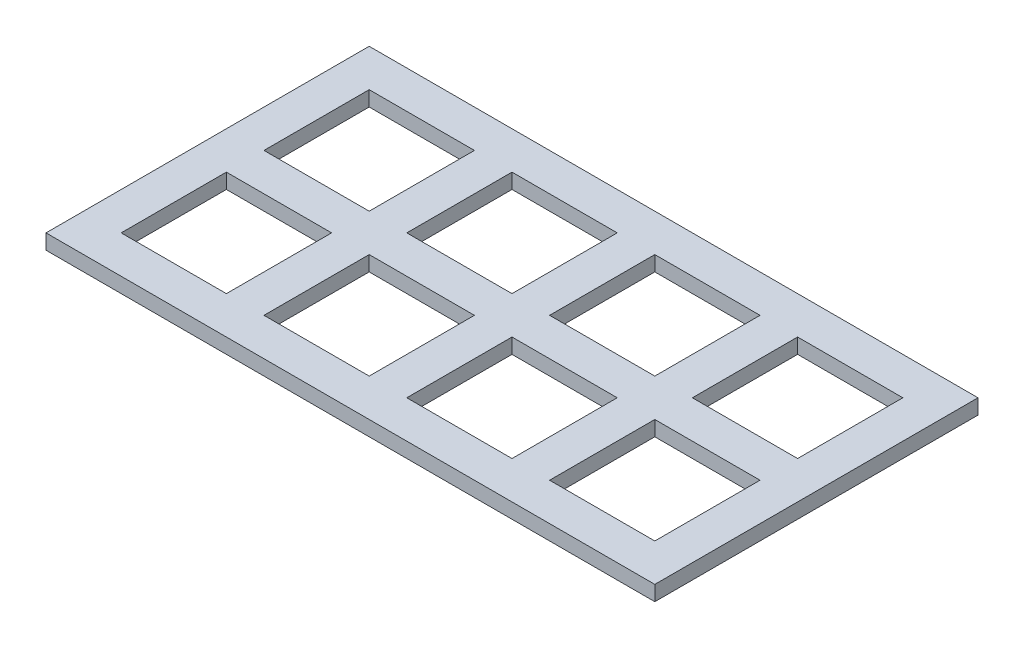
ISO-10303-21;
HEADER;
FILE_DESCRIPTION(('STEP AP214'),'2;1');
FILE_NAME('part.step','',(''),(''),'','','');
FILE_SCHEMA(('AUTOMOTIVE_DESIGN { 1 0 10303 214 1 1 1 1 }'));
ENDSEC;
DATA;
#1=APPLICATION_CONTEXT('core data for automotive mechanical design processes');
#2=APPLICATION_PROTOCOL_DEFINITION('international standard','automotive_design',2000,#1);
#3=PRODUCT_CONTEXT('',#1,'mechanical');
#4=PRODUCT('Part','Part','',(#3));
#5=PRODUCT_RELATED_PRODUCT_CATEGORY('part','',(#4));
#6=PRODUCT_DEFINITION_FORMATION('','',#4);
#7=PRODUCT_DEFINITION_CONTEXT('part definition',#1,'design');
#8=PRODUCT_DEFINITION('design','',#6,#7);
#9=PRODUCT_DEFINITION_SHAPE('','',#8);
#10=(LENGTH_UNIT() NAMED_UNIT(*) SI_UNIT(.MILLI.,.METRE.));
#11=(NAMED_UNIT(*) PLANE_ANGLE_UNIT() SI_UNIT($,.RADIAN.));
#12=(NAMED_UNIT(*) SI_UNIT($,.STERADIAN.) SOLID_ANGLE_UNIT());
#13=UNCERTAINTY_MEASURE_WITH_UNIT(LENGTH_MEASURE(1.E-05),#10,'distance_accuracy_value','');
#14=(GEOMETRIC_REPRESENTATION_CONTEXT(3) GLOBAL_UNCERTAINTY_ASSIGNED_CONTEXT((#13)) GLOBAL_UNIT_ASSIGNED_CONTEXT((#10,
#11,#12)) REPRESENTATION_CONTEXT('',''));
#15=CARTESIAN_POINT('',(0.,0.,0.));
#16=DIRECTION('',(0.,0.,1.));
#17=DIRECTION('',(1.,0.,0.));
#18=AXIS2_PLACEMENT_3D('',#15,#16,#17);
#19=CARTESIAN_POINT('',(0.,2.,0.));
#20=DIRECTION('',(0.,-1.,0.));
#21=DIRECTION('',(0.,0.,-1.));
#22=AXIS2_PLACEMENT_3D('',#19,#20,#21);
#23=PLANE('',#22);
#24=DIRECTION('',(0.,0.,1.));
#25=VECTOR('',#24,1.);
#26=CARTESIAN_POINT('',(21.5,2.,2.5));
#27=LINE('',#26,#25);
#28=CARTESIAN_POINT('',(21.5,2.,2.5));
#29=VERTEX_POINT('',#28);
#30=CARTESIAN_POINT('',(21.5,2.,16.5));
#31=VERTEX_POINT('',#30);
#32=EDGE_CURVE('E308',#29,#31,#27,.T.);
#33=ORIENTED_EDGE('',*,*,#32,.F.);
#34=DIRECTION('',(-1.,0.,0.));
#35=VECTOR('',#34,1.);
#36=CARTESIAN_POINT('',(21.5,2.,2.5));
#37=LINE('',#36,#35);
#38=CARTESIAN_POINT('',(35.5,2.,2.5));
#39=VERTEX_POINT('',#38);
#40=EDGE_CURVE('E316',#39,#29,#37,.T.);
#41=ORIENTED_EDGE('',*,*,#40,.F.);
#42=DIRECTION('',(0.,0.,-1.));
#43=VECTOR('',#42,1.);
#44=CARTESIAN_POINT('',(35.5,2.,2.5));
#45=LINE('',#44,#43);
#46=CARTESIAN_POINT('',(35.5,2.,16.5));
#47=VERTEX_POINT('',#46);
#48=EDGE_CURVE('E313',#47,#39,#45,.T.);
#49=ORIENTED_EDGE('',*,*,#48,.F.);
#50=DIRECTION('',(1.,0.,0.));
#51=VECTOR('',#50,1.);
#52=CARTESIAN_POINT('',(21.5,2.,16.5));
#53=LINE('',#52,#51);
#54=EDGE_CURVE('E310',#31,#47,#53,.T.);
#55=ORIENTED_EDGE('',*,*,#54,.F.);
#56=EDGE_LOOP('',(#33,#41,#49,#55));
#57=FACE_BOUND('',#56,.T.);
#58=DIRECTION('',(1.,0.,0.));
#59=VECTOR('',#58,1.);
#60=CARTESIAN_POINT('',(-2.5,2.,-2.5));
#61=LINE('',#60,#59);
#62=CARTESIAN_POINT('',(-16.5,2.,-2.5));
#63=VERTEX_POINT('',#62);
#64=CARTESIAN_POINT('',(-2.5,2.,-2.5));
#65=VERTEX_POINT('',#64);
#66=EDGE_CURVE('E370',#63,#65,#61,.T.);
#67=ORIENTED_EDGE('',*,*,#66,.F.);
#68=DIRECTION('',(0.,0.,1.));
#69=VECTOR('',#68,1.);
#70=CARTESIAN_POINT('',(-16.5,2.,-2.5));
#71=LINE('',#70,#69);
#72=CARTESIAN_POINT('',(-16.5,2.,-16.5));
#73=VERTEX_POINT('',#72);
#74=EDGE_CURVE('E378',#73,#63,#71,.T.);
#75=ORIENTED_EDGE('',*,*,#74,.F.);
#76=DIRECTION('',(-1.,0.,0.));
#77=VECTOR('',#76,1.);
#78=CARTESIAN_POINT('',(-2.5,2.,-16.5));
#79=LINE('',#78,#77);
#80=CARTESIAN_POINT('',(-2.5,2.,-16.5));
#81=VERTEX_POINT('',#80);
#82=EDGE_CURVE('E375',#81,#73,#79,.T.);
#83=ORIENTED_EDGE('',*,*,#82,.F.);
#84=DIRECTION('',(0.,0.,-1.));
#85=VECTOR('',#84,1.);
#86=CARTESIAN_POINT('',(-2.5,2.,-2.5));
#87=LINE('',#86,#85);
#88=EDGE_CURVE('E372',#65,#81,#87,.T.);
#89=ORIENTED_EDGE('',*,*,#88,.F.);
#90=EDGE_LOOP('',(#67,#75,#83,#89));
#91=FACE_BOUND('',#90,.T.);
#92=DIRECTION('',(1.,0.,0.));
#93=VECTOR('',#92,1.);
#94=CARTESIAN_POINT('',(21.5,2.,-2.5));
#95=LINE('',#94,#93);
#96=CARTESIAN_POINT('',(21.5,2.,-2.5));
#97=VERTEX_POINT('',#96);
#98=CARTESIAN_POINT('',(35.5,2.,-2.5));
#99=VERTEX_POINT('',#98);
#100=EDGE_CURVE('E432',#97,#99,#95,.T.);
#101=ORIENTED_EDGE('',*,*,#100,.F.);
#102=DIRECTION('',(0.,0.,1.));
#103=VECTOR('',#102,1.);
#104=CARTESIAN_POINT('',(21.5,2.,-2.5));
#105=LINE('',#104,#103);
#106=CARTESIAN_POINT('',(21.5,2.,-16.5));
#107=VERTEX_POINT('',#106);
#108=EDGE_CURVE('E440',#107,#97,#105,.T.);
#109=ORIENTED_EDGE('',*,*,#108,.F.);
#110=DIRECTION('',(-1.,0.,0.));
#111=VECTOR('',#110,1.);
#112=CARTESIAN_POINT('',(21.5,2.,-16.5));
#113=LINE('',#112,#111);
#114=CARTESIAN_POINT('',(35.5,2.,-16.5));
#115=VERTEX_POINT('',#114);
#116=EDGE_CURVE('E437',#115,#107,#113,.T.);
#117=ORIENTED_EDGE('',*,*,#116,.F.);
#118=DIRECTION('',(0.,0.,-1.));
#119=VECTOR('',#118,1.);
#120=CARTESIAN_POINT('',(35.5,2.,-2.5));
#121=LINE('',#120,#119);
#122=EDGE_CURVE('E434',#99,#115,#121,.T.);
#123=ORIENTED_EDGE('',*,*,#122,.F.);
#124=EDGE_LOOP('',(#101,#109,#117,#123));
#125=FACE_BOUND('',#124,.T.);
#126=DIRECTION('',(0.,0.,1.));
#127=VECTOR('',#126,1.);
#128=CARTESIAN_POINT('',(2.5,2.,-2.5));
#129=LINE('',#128,#127);
#130=CARTESIAN_POINT('',(2.5,2.,-16.5));
#131=VERTEX_POINT('',#130);
#132=CARTESIAN_POINT('',(2.5,2.,-2.5));
#133=VERTEX_POINT('',#132);
#134=EDGE_CURVE('E494',#131,#133,#129,.T.);
#135=ORIENTED_EDGE('',*,*,#134,.F.);
#136=DIRECTION('',(-1.,0.,0.));
#137=VECTOR('',#136,1.);
#138=CARTESIAN_POINT('',(2.5,2.,-16.5));
#139=LINE('',#138,#137);
#140=CARTESIAN_POINT('',(16.5,2.,-16.5));
#141=VERTEX_POINT('',#140);
#142=EDGE_CURVE('E502',#141,#131,#139,.T.);
#143=ORIENTED_EDGE('',*,*,#142,.F.);
#144=DIRECTION('',(0.,0.,-1.));
#145=VECTOR('',#144,1.);
#146=CARTESIAN_POINT('',(16.5,2.,-2.5));
#147=LINE('',#146,#145);
#148=CARTESIAN_POINT('',(16.5,2.,-2.5));
#149=VERTEX_POINT('',#148);
#150=EDGE_CURVE('E499',#149,#141,#147,.T.);
#151=ORIENTED_EDGE('',*,*,#150,.F.);
#152=DIRECTION('',(1.,0.,0.));
#153=VECTOR('',#152,1.);
#154=CARTESIAN_POINT('',(2.5,2.,-2.5));
#155=LINE('',#154,#153);
#156=EDGE_CURVE('E496',#133,#149,#155,.T.);
#157=ORIENTED_EDGE('',*,*,#156,.F.);
#158=EDGE_LOOP('',(#135,#143,#151,#157));
#159=FACE_BOUND('',#158,.T.);
#160=DIRECTION('',(0.,0.,-1.));
#161=VECTOR('',#160,1.);
#162=CARTESIAN_POINT('',(40.5,2.,-16.5));
#163=LINE('',#162,#161);
#164=CARTESIAN_POINT('',(40.5,2.,21.5));
#165=VERTEX_POINT('',#164);
#166=CARTESIAN_POINT('',(40.5,2.,-21.5));
#167=VERTEX_POINT('',#166);
#168=EDGE_CURVE('E525',#165,#167,#163,.T.);
#169=ORIENTED_EDGE('',*,*,#168,.T.);
#170=DIRECTION('',(-1.,0.,0.));
#171=VECTOR('',#170,1.);
#172=CARTESIAN_POINT('',(-40.5,2.,-21.5));
#173=LINE('',#172,#171);
#174=CARTESIAN_POINT('',(-40.5,2.,-21.5));
#175=VERTEX_POINT('',#174);
#176=EDGE_CURVE('E528',#167,#175,#173,.T.);
#177=ORIENTED_EDGE('',*,*,#176,.T.);
#178=DIRECTION('',(0.,0.,1.));
#179=VECTOR('',#178,1.);
#180=CARTESIAN_POINT('',(-40.5,2.,-16.5));
#181=LINE('',#180,#179);
#182=CARTESIAN_POINT('',(-40.5,2.,21.5));
#183=VERTEX_POINT('',#182);
#184=EDGE_CURVE('E531',#175,#183,#181,.T.);
#185=ORIENTED_EDGE('',*,*,#184,.T.);
#186=DIRECTION('',(1.,0.,0.));
#187=VECTOR('',#186,1.);
#188=CARTESIAN_POINT('',(-40.5,2.,21.5));
#189=LINE('',#188,#187);
#190=EDGE_CURVE('E533',#183,#165,#189,.T.);
#191=ORIENTED_EDGE('',*,*,#190,.T.);
#192=EDGE_LOOP('',(#169,#177,#185,#191));
#193=FACE_BOUND('',#192,.T.);
#194=DIRECTION('',(0.,0.,-1.));
#195=VECTOR('',#194,1.);
#196=CARTESIAN_POINT('',(-21.5,2.,-2.5));
#197=LINE('',#196,#195);
#198=CARTESIAN_POINT('',(-21.5,2.,-2.5));
#199=VERTEX_POINT('',#198);
#200=CARTESIAN_POINT('',(-21.5,2.,-16.5));
#201=VERTEX_POINT('',#200);
#202=EDGE_CURVE('E463',#199,#201,#197,.T.);
#203=ORIENTED_EDGE('',*,*,#202,.F.);
#204=DIRECTION('',(1.,0.,0.));
#205=VECTOR('',#204,1.);
#206=CARTESIAN_POINT('',(-21.5,2.,-2.5));
#207=LINE('',#206,#205);
#208=CARTESIAN_POINT('',(-35.5,2.,-2.5));
#209=VERTEX_POINT('',#208);
#210=EDGE_CURVE('E471',#209,#199,#207,.T.);
#211=ORIENTED_EDGE('',*,*,#210,.F.);
#212=DIRECTION('',(0.,0.,1.));
#213=VECTOR('',#212,1.);
#214=CARTESIAN_POINT('',(-35.5,2.,-2.5));
#215=LINE('',#214,#213);
#216=CARTESIAN_POINT('',(-35.5,2.,-16.5));
#217=VERTEX_POINT('',#216);
#218=EDGE_CURVE('E468',#217,#209,#215,.T.);
#219=ORIENTED_EDGE('',*,*,#218,.F.);
#220=DIRECTION('',(-1.,0.,0.));
#221=VECTOR('',#220,1.);
#222=CARTESIAN_POINT('',(-21.5,2.,-16.5));
#223=LINE('',#222,#221);
#224=EDGE_CURVE('E465',#201,#217,#223,.T.);
#225=ORIENTED_EDGE('',*,*,#224,.F.);
#226=EDGE_LOOP('',(#203,#211,#219,#225));
#227=FACE_BOUND('',#226,.T.);
#228=DIRECTION('',(-1.,0.,0.));
#229=VECTOR('',#228,1.);
#230=CARTESIAN_POINT('',(-21.5,2.,2.5));
#231=LINE('',#230,#229);
#232=CARTESIAN_POINT('',(-21.5,2.,2.5));
#233=VERTEX_POINT('',#232);
#234=CARTESIAN_POINT('',(-35.5,2.,2.5));
#235=VERTEX_POINT('',#234);
#236=EDGE_CURVE('E401',#233,#235,#231,.T.);
#237=ORIENTED_EDGE('',*,*,#236,.F.);
#238=DIRECTION('',(0.,0.,-1.));
#239=VECTOR('',#238,1.);
#240=CARTESIAN_POINT('',(-21.5,2.,2.5));
#241=LINE('',#240,#239);
#242=CARTESIAN_POINT('',(-21.5,2.,16.5));
#243=VERTEX_POINT('',#242);
#244=EDGE_CURVE('E409',#243,#233,#241,.T.);
#245=ORIENTED_EDGE('',*,*,#244,.F.);
#246=DIRECTION('',(1.,0.,0.));
#247=VECTOR('',#246,1.);
#248=CARTESIAN_POINT('',(-21.5,2.,16.5));
#249=LINE('',#248,#247);
#250=CARTESIAN_POINT('',(-35.5,2.,16.5));
#251=VERTEX_POINT('',#250);
#252=EDGE_CURVE('E406',#251,#243,#249,.T.);
#253=ORIENTED_EDGE('',*,*,#252,.F.);
#254=DIRECTION('',(0.,0.,1.));
#255=VECTOR('',#254,1.);
#256=CARTESIAN_POINT('',(-35.5,2.,2.5));
#257=LINE('',#256,#255);
#258=EDGE_CURVE('E403',#235,#251,#257,.T.);
#259=ORIENTED_EDGE('',*,*,#258,.F.);
#260=EDGE_LOOP('',(#237,#245,#253,#259));
#261=FACE_BOUND('',#260,.T.);
#262=DIRECTION('',(0.,0.,-1.));
#263=VECTOR('',#262,1.);
#264=CARTESIAN_POINT('',(-2.5,2.,2.5));
#265=LINE('',#264,#263);
#266=CARTESIAN_POINT('',(-2.5,2.,16.5));
#267=VERTEX_POINT('',#266);
#268=CARTESIAN_POINT('',(-2.5,2.,2.5));
#269=VERTEX_POINT('',#268);
#270=EDGE_CURVE('E339',#267,#269,#265,.T.);
#271=ORIENTED_EDGE('',*,*,#270,.F.);
#272=DIRECTION('',(1.,0.,0.));
#273=VECTOR('',#272,1.);
#274=CARTESIAN_POINT('',(-2.5,2.,16.5));
#275=LINE('',#274,#273);
#276=CARTESIAN_POINT('',(-16.5,2.,16.5));
#277=VERTEX_POINT('',#276);
#278=EDGE_CURVE('E347',#277,#267,#275,.T.);
#279=ORIENTED_EDGE('',*,*,#278,.F.);
#280=DIRECTION('',(0.,0.,1.));
#281=VECTOR('',#280,1.);
#282=CARTESIAN_POINT('',(-16.5,2.,2.5));
#283=LINE('',#282,#281);
#284=CARTESIAN_POINT('',(-16.5,2.,2.5));
#285=VERTEX_POINT('',#284);
#286=EDGE_CURVE('E344',#285,#277,#283,.T.);
#287=ORIENTED_EDGE('',*,*,#286,.F.);
#288=DIRECTION('',(-1.,0.,0.));
#289=VECTOR('',#288,1.);
#290=CARTESIAN_POINT('',(-2.5,2.,2.5));
#291=LINE('',#290,#289);
#292=EDGE_CURVE('E341',#269,#285,#291,.T.);
#293=ORIENTED_EDGE('',*,*,#292,.F.);
#294=EDGE_LOOP('',(#271,#279,#287,#293));
#295=FACE_BOUND('',#294,.T.);
#296=DIRECTION('',(-1.,0.,0.));
#297=VECTOR('',#296,1.);
#298=CARTESIAN_POINT('',(2.5,2.,2.5));
#299=LINE('',#298,#297);
#300=CARTESIAN_POINT('',(16.5,2.,2.5));
#301=VERTEX_POINT('',#300);
#302=CARTESIAN_POINT('',(2.5,2.,2.5));
#303=VERTEX_POINT('',#302);
#304=EDGE_CURVE('E272',#301,#303,#299,.T.);
#305=ORIENTED_EDGE('',*,*,#304,.F.);
#306=DIRECTION('',(0.,0.,-1.));
#307=VECTOR('',#306,1.);
#308=CARTESIAN_POINT('',(16.5,2.,2.5));
#309=LINE('',#308,#307);
#310=CARTESIAN_POINT('',(16.5,2.,16.5));
#311=VERTEX_POINT('',#310);
#312=EDGE_CURVE('E294',#311,#301,#309,.T.);
#313=ORIENTED_EDGE('',*,*,#312,.F.);
#314=DIRECTION('',(1.,0.,0.));
#315=VECTOR('',#314,1.);
#316=CARTESIAN_POINT('',(2.5,2.,16.5));
#317=LINE('',#316,#315);
#318=CARTESIAN_POINT('',(2.5,2.,16.5));
#319=VERTEX_POINT('',#318);
#320=EDGE_CURVE('E292',#319,#311,#317,.T.);
#321=ORIENTED_EDGE('',*,*,#320,.F.);
#322=DIRECTION('',(0.,0.,1.));
#323=VECTOR('',#322,1.);
#324=CARTESIAN_POINT('',(2.5,2.,2.5));
#325=LINE('',#324,#323);
#326=EDGE_CURVE('E280',#303,#319,#325,.T.);
#327=ORIENTED_EDGE('',*,*,#326,.F.);
#328=EDGE_LOOP('',(#305,#313,#321,#327));
#329=FACE_BOUND('',#328,.T.);
#330=ADVANCED_FACE('F39',(#57,#91,#125,#159,#193,#227,#261,#295,#329),#23,.F.);
#331=CARTESIAN_POINT('',(0.,0.,0.));
#332=DIRECTION('',(0.,-1.,0.));
#333=DIRECTION('',(0.,0.,-1.));
#334=AXIS2_PLACEMENT_3D('',#331,#332,#333);
#335=PLANE('',#334);
#336=DIRECTION('',(-1.,0.,0.));
#337=VECTOR('',#336,1.);
#338=CARTESIAN_POINT('',(-40.5,0.,-21.5));
#339=LINE('',#338,#337);
#340=CARTESIAN_POINT('',(40.5,0.,-21.5));
#341=VERTEX_POINT('',#340);
#342=CARTESIAN_POINT('',(-40.5,0.,-21.5));
#343=VERTEX_POINT('',#342);
#344=EDGE_CURVE('E524',#341,#343,#339,.T.);
#345=ORIENTED_EDGE('',*,*,#344,.F.);
#346=DIRECTION('',(0.,0.,-1.));
#347=VECTOR('',#346,1.);
#348=CARTESIAN_POINT('',(40.5,0.,-16.5));
#349=LINE('',#348,#347);
#350=CARTESIAN_POINT('',(40.5,0.,21.5));
#351=VERTEX_POINT('',#350);
#352=EDGE_CURVE('E529',#351,#341,#349,.T.);
#353=ORIENTED_EDGE('',*,*,#352,.F.);
#354=DIRECTION('',(1.,0.,0.));
#355=VECTOR('',#354,1.);
#356=CARTESIAN_POINT('',(-40.5,0.,21.5));
#357=LINE('',#356,#355);
#358=CARTESIAN_POINT('',(-40.5,0.,21.5));
#359=VERTEX_POINT('',#358);
#360=EDGE_CURVE('E541',#359,#351,#357,.T.);
#361=ORIENTED_EDGE('',*,*,#360,.F.);
#362=DIRECTION('',(0.,0.,1.));
#363=VECTOR('',#362,1.);
#364=CARTESIAN_POINT('',(-40.5,0.,16.5));
#365=LINE('',#364,#363);
#366=EDGE_CURVE('E539',#343,#359,#365,.T.);
#367=ORIENTED_EDGE('',*,*,#366,.F.);
#368=EDGE_LOOP('',(#345,#353,#361,#367));
#369=FACE_BOUND('',#368,.T.);
#370=DIRECTION('',(-1.,0.,0.));
#371=VECTOR('',#370,1.);
#372=CARTESIAN_POINT('',(2.5,0.,-16.5));
#373=LINE('',#372,#371);
#374=CARTESIAN_POINT('',(16.5,0.,-16.5));
#375=VERTEX_POINT('',#374);
#376=CARTESIAN_POINT('',(2.5,0.,-16.5));
#377=VERTEX_POINT('',#376);
#378=EDGE_CURVE('E497',#375,#377,#373,.T.);
#379=ORIENTED_EDGE('',*,*,#378,.T.);
#380=DIRECTION('',(0.,0.,1.));
#381=VECTOR('',#380,1.);
#382=CARTESIAN_POINT('',(2.5,0.,-2.5));
#383=LINE('',#382,#381);
#384=CARTESIAN_POINT('',(2.5,0.,-2.5));
#385=VERTEX_POINT('',#384);
#386=EDGE_CURVE('E493',#377,#385,#383,.T.);
#387=ORIENTED_EDGE('',*,*,#386,.T.);
#388=DIRECTION('',(1.,0.,0.));
#389=VECTOR('',#388,1.);
#390=CARTESIAN_POINT('',(2.5,0.,-2.5));
#391=LINE('',#390,#389);
#392=CARTESIAN_POINT('',(16.5,0.,-2.5));
#393=VERTEX_POINT('',#392);
#394=EDGE_CURVE('E507',#385,#393,#391,.T.);
#395=ORIENTED_EDGE('',*,*,#394,.T.);
#396=DIRECTION('',(0.,0.,-1.));
#397=VECTOR('',#396,1.);
#398=CARTESIAN_POINT('',(16.5,0.,-2.5));
#399=LINE('',#398,#397);
#400=EDGE_CURVE('E510',#393,#375,#399,.T.);
#401=ORIENTED_EDGE('',*,*,#400,.T.);
#402=EDGE_LOOP('',(#379,#387,#395,#401));
#403=FACE_BOUND('',#402,.T.);
#404=DIRECTION('',(1.,0.,0.));
#405=VECTOR('',#404,1.);
#406=CARTESIAN_POINT('',(-21.5,0.,-2.5));
#407=LINE('',#406,#405);
#408=CARTESIAN_POINT('',(-35.5,0.,-2.5));
#409=VERTEX_POINT('',#408);
#410=CARTESIAN_POINT('',(-21.5,0.,-2.5));
#411=VERTEX_POINT('',#410);
#412=EDGE_CURVE('E466',#409,#411,#407,.T.);
#413=ORIENTED_EDGE('',*,*,#412,.T.);
#414=DIRECTION('',(0.,0.,-1.));
#415=VECTOR('',#414,1.);
#416=CARTESIAN_POINT('',(-21.5,0.,-2.5));
#417=LINE('',#416,#415);
#418=CARTESIAN_POINT('',(-21.5,0.,-16.5));
#419=VERTEX_POINT('',#418);
#420=EDGE_CURVE('E462',#411,#419,#417,.T.);
#421=ORIENTED_EDGE('',*,*,#420,.T.);
#422=DIRECTION('',(-1.,0.,0.));
#423=VECTOR('',#422,1.);
#424=CARTESIAN_POINT('',(-21.5,0.,-16.5));
#425=LINE('',#424,#423);
#426=CARTESIAN_POINT('',(-35.5,0.,-16.5));
#427=VERTEX_POINT('',#426);
#428=EDGE_CURVE('E476',#419,#427,#425,.T.);
#429=ORIENTED_EDGE('',*,*,#428,.T.);
#430=DIRECTION('',(0.,0.,1.));
#431=VECTOR('',#430,1.);
#432=CARTESIAN_POINT('',(-35.5,0.,-2.5));
#433=LINE('',#432,#431);
#434=EDGE_CURVE('E479',#427,#409,#433,.T.);
#435=ORIENTED_EDGE('',*,*,#434,.T.);
#436=EDGE_LOOP('',(#413,#421,#429,#435));
#437=FACE_BOUND('',#436,.T.);
#438=DIRECTION('',(0.,0.,1.));
#439=VECTOR('',#438,1.);
#440=CARTESIAN_POINT('',(21.5,0.,-2.5));
#441=LINE('',#440,#439);
#442=CARTESIAN_POINT('',(21.5,0.,-16.5));
#443=VERTEX_POINT('',#442);
#444=CARTESIAN_POINT('',(21.5,0.,-2.5));
#445=VERTEX_POINT('',#444);
#446=EDGE_CURVE('E435',#443,#445,#441,.T.);
#447=ORIENTED_EDGE('',*,*,#446,.T.);
#448=DIRECTION('',(1.,0.,0.));
#449=VECTOR('',#448,1.);
#450=CARTESIAN_POINT('',(21.5,0.,-2.5));
#451=LINE('',#450,#449);
#452=CARTESIAN_POINT('',(35.5,0.,-2.5));
#453=VERTEX_POINT('',#452);
#454=EDGE_CURVE('E431',#445,#453,#451,.T.);
#455=ORIENTED_EDGE('',*,*,#454,.T.);
#456=DIRECTION('',(0.,0.,-1.));
#457=VECTOR('',#456,1.);
#458=CARTESIAN_POINT('',(35.5,0.,-2.5));
#459=LINE('',#458,#457);
#460=CARTESIAN_POINT('',(35.5,0.,-16.5));
#461=VERTEX_POINT('',#460);
#462=EDGE_CURVE('E445',#453,#461,#459,.T.);
#463=ORIENTED_EDGE('',*,*,#462,.T.);
#464=DIRECTION('',(-1.,0.,0.));
#465=VECTOR('',#464,1.);
#466=CARTESIAN_POINT('',(21.5,0.,-16.5));
#467=LINE('',#466,#465);
#468=EDGE_CURVE('E448',#461,#443,#467,.T.);
#469=ORIENTED_EDGE('',*,*,#468,.T.);
#470=EDGE_LOOP('',(#447,#455,#463,#469));
#471=FACE_BOUND('',#470,.T.);
#472=DIRECTION('',(0.,0.,-1.));
#473=VECTOR('',#472,1.);
#474=CARTESIAN_POINT('',(-21.5,0.,2.5));
#475=LINE('',#474,#473);
#476=CARTESIAN_POINT('',(-21.5,0.,16.5));
#477=VERTEX_POINT('',#476);
#478=CARTESIAN_POINT('',(-21.5,0.,2.5));
#479=VERTEX_POINT('',#478);
#480=EDGE_CURVE('E404',#477,#479,#475,.T.);
#481=ORIENTED_EDGE('',*,*,#480,.T.);
#482=DIRECTION('',(-1.,0.,0.));
#483=VECTOR('',#482,1.);
#484=CARTESIAN_POINT('',(-21.5,0.,2.5));
#485=LINE('',#484,#483);
#486=CARTESIAN_POINT('',(-35.5,0.,2.5));
#487=VERTEX_POINT('',#486);
#488=EDGE_CURVE('E400',#479,#487,#485,.T.);
#489=ORIENTED_EDGE('',*,*,#488,.T.);
#490=DIRECTION('',(0.,0.,1.));
#491=VECTOR('',#490,1.);
#492=CARTESIAN_POINT('',(-35.5,0.,2.5));
#493=LINE('',#492,#491);
#494=CARTESIAN_POINT('',(-35.5,0.,16.5));
#495=VERTEX_POINT('',#494);
#496=EDGE_CURVE('E414',#487,#495,#493,.T.);
#497=ORIENTED_EDGE('',*,*,#496,.T.);
#498=DIRECTION('',(1.,0.,0.));
#499=VECTOR('',#498,1.);
#500=CARTESIAN_POINT('',(-21.5,0.,16.5));
#501=LINE('',#500,#499);
#502=EDGE_CURVE('E417',#495,#477,#501,.T.);
#503=ORIENTED_EDGE('',*,*,#502,.T.);
#504=EDGE_LOOP('',(#481,#489,#497,#503));
#505=FACE_BOUND('',#504,.T.);
#506=DIRECTION('',(0.,0.,1.));
#507=VECTOR('',#506,1.);
#508=CARTESIAN_POINT('',(-16.5,0.,-2.5));
#509=LINE('',#508,#507);
#510=CARTESIAN_POINT('',(-16.5,0.,-16.5));
#511=VERTEX_POINT('',#510);
#512=CARTESIAN_POINT('',(-16.5,0.,-2.5));
#513=VERTEX_POINT('',#512);
#514=EDGE_CURVE('E373',#511,#513,#509,.T.);
#515=ORIENTED_EDGE('',*,*,#514,.T.);
#516=DIRECTION('',(1.,0.,0.));
#517=VECTOR('',#516,1.);
#518=CARTESIAN_POINT('',(-2.5,0.,-2.5));
#519=LINE('',#518,#517);
#520=CARTESIAN_POINT('',(-2.5,0.,-2.5));
#521=VERTEX_POINT('',#520);
#522=EDGE_CURVE('E369',#513,#521,#519,.T.);
#523=ORIENTED_EDGE('',*,*,#522,.T.);
#524=DIRECTION('',(0.,0.,-1.));
#525=VECTOR('',#524,1.);
#526=CARTESIAN_POINT('',(-2.5,0.,-2.5));
#527=LINE('',#526,#525);
#528=CARTESIAN_POINT('',(-2.5,0.,-16.5));
#529=VERTEX_POINT('',#528);
#530=EDGE_CURVE('E383',#521,#529,#527,.T.);
#531=ORIENTED_EDGE('',*,*,#530,.T.);
#532=DIRECTION('',(-1.,0.,0.));
#533=VECTOR('',#532,1.);
#534=CARTESIAN_POINT('',(-2.5,0.,-16.5));
#535=LINE('',#534,#533);
#536=EDGE_CURVE('E386',#529,#511,#535,.T.);
#537=ORIENTED_EDGE('',*,*,#536,.T.);
#538=EDGE_LOOP('',(#515,#523,#531,#537));
#539=FACE_BOUND('',#538,.T.);
#540=DIRECTION('',(1.,0.,0.));
#541=VECTOR('',#540,1.);
#542=CARTESIAN_POINT('',(-2.5,0.,16.5));
#543=LINE('',#542,#541);
#544=CARTESIAN_POINT('',(-16.5,0.,16.5));
#545=VERTEX_POINT('',#544);
#546=CARTESIAN_POINT('',(-2.5,0.,16.5));
#547=VERTEX_POINT('',#546);
#548=EDGE_CURVE('E342',#545,#547,#543,.T.);
#549=ORIENTED_EDGE('',*,*,#548,.T.);
#550=DIRECTION('',(0.,0.,-1.));
#551=VECTOR('',#550,1.);
#552=CARTESIAN_POINT('',(-2.5,0.,2.5));
#553=LINE('',#552,#551);
#554=CARTESIAN_POINT('',(-2.5,0.,2.5));
#555=VERTEX_POINT('',#554);
#556=EDGE_CURVE('E338',#547,#555,#553,.T.);
#557=ORIENTED_EDGE('',*,*,#556,.T.);
#558=DIRECTION('',(-1.,0.,0.));
#559=VECTOR('',#558,1.);
#560=CARTESIAN_POINT('',(-2.5,0.,2.5));
#561=LINE('',#560,#559);
#562=CARTESIAN_POINT('',(-16.5,0.,2.5));
#563=VERTEX_POINT('',#562);
#564=EDGE_CURVE('E352',#555,#563,#561,.T.);
#565=ORIENTED_EDGE('',*,*,#564,.T.);
#566=DIRECTION('',(0.,0.,1.));
#567=VECTOR('',#566,1.);
#568=CARTESIAN_POINT('',(-16.5,0.,2.5));
#569=LINE('',#568,#567);
#570=EDGE_CURVE('E355',#563,#545,#569,.T.);
#571=ORIENTED_EDGE('',*,*,#570,.T.);
#572=EDGE_LOOP('',(#549,#557,#565,#571));
#573=FACE_BOUND('',#572,.T.);
#574=DIRECTION('',(-1.,0.,0.));
#575=VECTOR('',#574,1.);
#576=CARTESIAN_POINT('',(21.5,0.,2.5));
#577=LINE('',#576,#575);
#578=CARTESIAN_POINT('',(35.5,0.,2.5));
#579=VERTEX_POINT('',#578);
#580=CARTESIAN_POINT('',(21.5,0.,2.5));
#581=VERTEX_POINT('',#580);
#582=EDGE_CURVE('E311',#579,#581,#577,.T.);
#583=ORIENTED_EDGE('',*,*,#582,.T.);
#584=DIRECTION('',(0.,0.,1.));
#585=VECTOR('',#584,1.);
#586=CARTESIAN_POINT('',(21.5,0.,2.5));
#587=LINE('',#586,#585);
#588=CARTESIAN_POINT('',(21.5,0.,16.5));
#589=VERTEX_POINT('',#588);
#590=EDGE_CURVE('E288',#581,#589,#587,.T.);
#591=ORIENTED_EDGE('',*,*,#590,.T.);
#592=DIRECTION('',(1.,0.,0.));
#593=VECTOR('',#592,1.);
#594=CARTESIAN_POINT('',(21.5,0.,16.5));
#595=LINE('',#594,#593);
#596=CARTESIAN_POINT('',(35.5,0.,16.5));
#597=VERTEX_POINT('',#596);
#598=EDGE_CURVE('E321',#589,#597,#595,.T.);
#599=ORIENTED_EDGE('',*,*,#598,.T.);
#600=DIRECTION('',(0.,0.,-1.));
#601=VECTOR('',#600,1.);
#602=CARTESIAN_POINT('',(35.5,0.,2.5));
#603=LINE('',#602,#601);
#604=EDGE_CURVE('E324',#597,#579,#603,.T.);
#605=ORIENTED_EDGE('',*,*,#604,.T.);
#606=EDGE_LOOP('',(#583,#591,#599,#605));
#607=FACE_BOUND('',#606,.T.);
#608=DIRECTION('',(0.,0.,-1.));
#609=VECTOR('',#608,1.);
#610=CARTESIAN_POINT('',(16.5,0.,2.5));
#611=LINE('',#610,#609);
#612=CARTESIAN_POINT('',(16.5,0.,16.5));
#613=VERTEX_POINT('',#612);
#614=CARTESIAN_POINT('',(16.5,0.,2.5));
#615=VERTEX_POINT('',#614);
#616=EDGE_CURVE('E281',#613,#615,#611,.T.);
#617=ORIENTED_EDGE('',*,*,#616,.T.);
#618=DIRECTION('',(-1.,0.,0.));
#619=VECTOR('',#618,1.);
#620=CARTESIAN_POINT('',(2.5,0.,2.5));
#621=LINE('',#620,#619);
#622=CARTESIAN_POINT('',(2.5,0.,2.5));
#623=VERTEX_POINT('',#622);
#624=EDGE_CURVE('E62',#615,#623,#621,.T.);
#625=ORIENTED_EDGE('',*,*,#624,.T.);
#626=DIRECTION('',(0.,0.,1.));
#627=VECTOR('',#626,1.);
#628=CARTESIAN_POINT('',(2.5,0.,2.5));
#629=LINE('',#628,#627);
#630=CARTESIAN_POINT('',(2.5,0.,16.5));
#631=VERTEX_POINT('',#630);
#632=EDGE_CURVE('E287',#623,#631,#629,.T.);
#633=ORIENTED_EDGE('',*,*,#632,.T.);
#634=DIRECTION('',(1.,0.,0.));
#635=VECTOR('',#634,1.);
#636=CARTESIAN_POINT('',(2.5,0.,16.5));
#637=LINE('',#636,#635);
#638=EDGE_CURVE('E300',#631,#613,#637,.T.);
#639=ORIENTED_EDGE('',*,*,#638,.T.);
#640=EDGE_LOOP('',(#617,#625,#633,#639));
#641=FACE_BOUND('',#640,.T.);
#642=ADVANCED_FACE('F559',(#369,#403,#437,#471,#505,#539,#573,#607,#641),#335,.T.);
#643=CARTESIAN_POINT('',(-40.5,2.,-21.5));
#644=DIRECTION('',(0.,0.,1.));
#645=DIRECTION('',(1.,0.,0.));
#646=AXIS2_PLACEMENT_3D('',#643,#644,#645);
#647=PLANE('',#646);
#648=ORIENTED_EDGE('',*,*,#344,.T.);
#649=DIRECTION('',(0.,-1.,0.));
#650=VECTOR('',#649,1.);
#651=CARTESIAN_POINT('',(-40.5,2.,-21.5));
#652=LINE('',#651,#650);
#653=EDGE_CURVE('E47',#175,#343,#652,.T.);
#654=ORIENTED_EDGE('',*,*,#653,.F.);
#655=ORIENTED_EDGE('',*,*,#176,.F.);
#656=DIRECTION('',(0.,-1.,0.));
#657=VECTOR('',#656,1.);
#658=CARTESIAN_POINT('',(40.5,2.,-21.5));
#659=LINE('',#658,#657);
#660=EDGE_CURVE('E11',#167,#341,#659,.T.);
#661=ORIENTED_EDGE('',*,*,#660,.T.);
#662=EDGE_LOOP('',(#648,#654,#655,#661));
#663=FACE_BOUND('',#662,.T.);
#664=ADVANCED_FACE('F41',(#663),#647,.F.);
#665=CARTESIAN_POINT('',(-40.5,2.,16.5));
#666=DIRECTION('',(1.,0.,0.));
#667=DIRECTION('',(0.,0.,-1.));
#668=AXIS2_PLACEMENT_3D('',#665,#666,#667);
#669=PLANE('',#668);
#670=ORIENTED_EDGE('',*,*,#366,.T.);
#671=DIRECTION('',(0.,-1.,0.));
#672=VECTOR('',#671,1.);
#673=CARTESIAN_POINT('',(-40.5,2.,21.5));
#674=LINE('',#673,#672);
#675=EDGE_CURVE('E547',#183,#359,#674,.T.);
#676=ORIENTED_EDGE('',*,*,#675,.F.);
#677=ORIENTED_EDGE('',*,*,#184,.F.);
#678=ORIENTED_EDGE('',*,*,#653,.T.);
#679=EDGE_LOOP('',(#670,#676,#677,#678));
#680=FACE_BOUND('',#679,.T.);
#681=ADVANCED_FACE('F553',(#680),#669,.F.);
#682=CARTESIAN_POINT('',(-40.5,2.,21.5));
#683=DIRECTION('',(0.,0.,-1.));
#684=DIRECTION('',(-1.,0.,0.));
#685=AXIS2_PLACEMENT_3D('',#682,#683,#684);
#686=PLANE('',#685);
#687=ORIENTED_EDGE('',*,*,#360,.T.);
#688=DIRECTION('',(0.,-1.,0.));
#689=VECTOR('',#688,1.);
#690=CARTESIAN_POINT('',(40.5,2.,21.5));
#691=LINE('',#690,#689);
#692=EDGE_CURVE('E536',#165,#351,#691,.T.);
#693=ORIENTED_EDGE('',*,*,#692,.F.);
#694=ORIENTED_EDGE('',*,*,#190,.F.);
#695=ORIENTED_EDGE('',*,*,#675,.T.);
#696=EDGE_LOOP('',(#687,#693,#694,#695));
#697=FACE_BOUND('',#696,.T.);
#698=ADVANCED_FACE('F564',(#697),#686,.F.);
#699=CARTESIAN_POINT('',(40.5,2.,-16.5));
#700=DIRECTION('',(-1.,0.,0.));
#701=DIRECTION('',(0.,0.,1.));
#702=AXIS2_PLACEMENT_3D('',#699,#700,#701);
#703=PLANE('',#702);
#704=ORIENTED_EDGE('',*,*,#352,.T.);
#705=ORIENTED_EDGE('',*,*,#660,.F.);
#706=ORIENTED_EDGE('',*,*,#168,.F.);
#707=ORIENTED_EDGE('',*,*,#692,.T.);
#708=EDGE_LOOP('',(#704,#705,#706,#707));
#709=FACE_BOUND('',#708,.T.);
#710=ADVANCED_FACE('F567',(#709),#703,.F.);
#711=CARTESIAN_POINT('',(2.5,2.,-2.5));
#712=DIRECTION('',(1.,0.,0.));
#713=DIRECTION('',(0.,0.,-1.));
#714=AXIS2_PLACEMENT_3D('',#711,#712,#713);
#715=PLANE('',#714);
#716=ORIENTED_EDGE('',*,*,#386,.F.);
#717=DIRECTION('',(0.,-1.,0.));
#718=VECTOR('',#717,1.);
#719=CARTESIAN_POINT('',(2.5,2.,-16.5));
#720=LINE('',#719,#718);
#721=EDGE_CURVE('E504',#131,#377,#720,.T.);
#722=ORIENTED_EDGE('',*,*,#721,.F.);
#723=ORIENTED_EDGE('',*,*,#134,.T.);
#724=DIRECTION('',(0.,-1.,0.));
#725=VECTOR('',#724,1.);
#726=CARTESIAN_POINT('',(2.5,2.,-2.5));
#727=LINE('',#726,#725);
#728=EDGE_CURVE('E521',#133,#385,#727,.T.);
#729=ORIENTED_EDGE('',*,*,#728,.T.);
#730=EDGE_LOOP('',(#716,#722,#723,#729));
#731=FACE_BOUND('',#730,.T.);
#732=ADVANCED_FACE('F688',(#731),#715,.T.);
#733=CARTESIAN_POINT('',(2.5,2.,-2.5));
#734=DIRECTION('',(0.,0.,-1.));
#735=DIRECTION('',(-1.,0.,0.));
#736=AXIS2_PLACEMENT_3D('',#733,#734,#735);
#737=PLANE('',#736);
#738=ORIENTED_EDGE('',*,*,#394,.F.);
#739=ORIENTED_EDGE('',*,*,#728,.F.);
#740=ORIENTED_EDGE('',*,*,#156,.T.);
#741=DIRECTION('',(0.,-1.,0.));
#742=VECTOR('',#741,1.);
#743=CARTESIAN_POINT('',(16.5,2.,-2.5));
#744=LINE('',#743,#742);
#745=EDGE_CURVE('E519',#149,#393,#744,.T.);
#746=ORIENTED_EDGE('',*,*,#745,.T.);
#747=EDGE_LOOP('',(#738,#739,#740,#746));
#748=FACE_BOUND('',#747,.T.);
#749=ADVANCED_FACE('F684',(#748),#737,.T.);
#750=CARTESIAN_POINT('',(16.5,2.,-2.5));
#751=DIRECTION('',(-1.,0.,0.));
#752=DIRECTION('',(0.,0.,1.));
#753=AXIS2_PLACEMENT_3D('',#750,#751,#752);
#754=PLANE('',#753);
#755=ORIENTED_EDGE('',*,*,#400,.F.);
#756=ORIENTED_EDGE('',*,*,#745,.F.);
#757=ORIENTED_EDGE('',*,*,#150,.T.);
#758=DIRECTION('',(0.,-1.,0.));
#759=VECTOR('',#758,1.);
#760=CARTESIAN_POINT('',(16.5,2.,-16.5));
#761=LINE('',#760,#759);
#762=EDGE_CURVE('E517',#141,#375,#761,.T.);
#763=ORIENTED_EDGE('',*,*,#762,.T.);
#764=EDGE_LOOP('',(#755,#756,#757,#763));
#765=FACE_BOUND('',#764,.T.);
#766=ADVANCED_FACE('F680',(#765),#754,.T.);
#767=CARTESIAN_POINT('',(2.5,2.,-16.5));
#768=DIRECTION('',(0.,0.,1.));
#769=DIRECTION('',(1.,0.,0.));
#770=AXIS2_PLACEMENT_3D('',#767,#768,#769);
#771=PLANE('',#770);
#772=ORIENTED_EDGE('',*,*,#378,.F.);
#773=ORIENTED_EDGE('',*,*,#762,.F.);
#774=ORIENTED_EDGE('',*,*,#142,.T.);
#775=ORIENTED_EDGE('',*,*,#721,.T.);
#776=EDGE_LOOP('',(#772,#773,#774,#775));
#777=FACE_BOUND('',#776,.T.);
#778=ADVANCED_FACE('F676',(#777),#771,.T.);
#779=CARTESIAN_POINT('',(-21.5,2.,-2.5));
#780=DIRECTION('',(-1.,0.,0.));
#781=DIRECTION('',(0.,0.,1.));
#782=AXIS2_PLACEMENT_3D('',#779,#780,#781);
#783=PLANE('',#782);
#784=ORIENTED_EDGE('',*,*,#420,.F.);
#785=DIRECTION('',(0.,-1.,0.));
#786=VECTOR('',#785,1.);
#787=CARTESIAN_POINT('',(-21.5,2.,-2.5));
#788=LINE('',#787,#786);
#789=EDGE_CURVE('E473',#199,#411,#788,.T.);
#790=ORIENTED_EDGE('',*,*,#789,.F.);
#791=ORIENTED_EDGE('',*,*,#202,.T.);
#792=DIRECTION('',(0.,-1.,0.));
#793=VECTOR('',#792,1.);
#794=CARTESIAN_POINT('',(-21.5,2.,-16.5));
#795=LINE('',#794,#793);
#796=EDGE_CURVE('E490',#201,#419,#795,.T.);
#797=ORIENTED_EDGE('',*,*,#796,.T.);
#798=EDGE_LOOP('',(#784,#790,#791,#797));
#799=FACE_BOUND('',#798,.T.);
#800=ADVANCED_FACE('F672',(#799),#783,.T.);
#801=CARTESIAN_POINT('',(-21.5,2.,-16.5));
#802=DIRECTION('',(0.,0.,1.));
#803=DIRECTION('',(1.,0.,0.));
#804=AXIS2_PLACEMENT_3D('',#801,#802,#803);
#805=PLANE('',#804);
#806=ORIENTED_EDGE('',*,*,#428,.F.);
#807=ORIENTED_EDGE('',*,*,#796,.F.);
#808=ORIENTED_EDGE('',*,*,#224,.T.);
#809=DIRECTION('',(0.,-1.,0.));
#810=VECTOR('',#809,1.);
#811=CARTESIAN_POINT('',(-35.5,2.,-16.5));
#812=LINE('',#811,#810);
#813=EDGE_CURVE('E488',#217,#427,#812,.T.);
#814=ORIENTED_EDGE('',*,*,#813,.T.);
#815=EDGE_LOOP('',(#806,#807,#808,#814));
#816=FACE_BOUND('',#815,.T.);
#817=ADVANCED_FACE('F668',(#816),#805,.T.);
#818=CARTESIAN_POINT('',(-35.5,2.,-2.5));
#819=DIRECTION('',(1.,0.,0.));
#820=DIRECTION('',(0.,0.,-1.));
#821=AXIS2_PLACEMENT_3D('',#818,#819,#820);
#822=PLANE('',#821);
#823=ORIENTED_EDGE('',*,*,#434,.F.);
#824=ORIENTED_EDGE('',*,*,#813,.F.);
#825=ORIENTED_EDGE('',*,*,#218,.T.);
#826=DIRECTION('',(0.,-1.,0.));
#827=VECTOR('',#826,1.);
#828=CARTESIAN_POINT('',(-35.5,2.,-2.5));
#829=LINE('',#828,#827);
#830=EDGE_CURVE('E486',#209,#409,#829,.T.);
#831=ORIENTED_EDGE('',*,*,#830,.T.);
#832=EDGE_LOOP('',(#823,#824,#825,#831));
#833=FACE_BOUND('',#832,.T.);
#834=ADVANCED_FACE('F664',(#833),#822,.T.);
#835=CARTESIAN_POINT('',(-21.5,2.,-2.5));
#836=DIRECTION('',(0.,0.,-1.));
#837=DIRECTION('',(-1.,0.,0.));
#838=AXIS2_PLACEMENT_3D('',#835,#836,#837);
#839=PLANE('',#838);
#840=ORIENTED_EDGE('',*,*,#412,.F.);
#841=ORIENTED_EDGE('',*,*,#830,.F.);
#842=ORIENTED_EDGE('',*,*,#210,.T.);
#843=ORIENTED_EDGE('',*,*,#789,.T.);
#844=EDGE_LOOP('',(#840,#841,#842,#843));
#845=FACE_BOUND('',#844,.T.);
#846=ADVANCED_FACE('F660',(#845),#839,.T.);
#847=CARTESIAN_POINT('',(21.5,2.,-2.5));
#848=DIRECTION('',(0.,0.,-1.));
#849=DIRECTION('',(-1.,0.,0.));
#850=AXIS2_PLACEMENT_3D('',#847,#848,#849);
#851=PLANE('',#850);
#852=ORIENTED_EDGE('',*,*,#454,.F.);
#853=DIRECTION('',(0.,-1.,0.));
#854=VECTOR('',#853,1.);
#855=CARTESIAN_POINT('',(21.5,2.,-2.5));
#856=LINE('',#855,#854);
#857=EDGE_CURVE('E442',#97,#445,#856,.T.);
#858=ORIENTED_EDGE('',*,*,#857,.F.);
#859=ORIENTED_EDGE('',*,*,#100,.T.);
#860=DIRECTION('',(0.,-1.,0.));
#861=VECTOR('',#860,1.);
#862=CARTESIAN_POINT('',(35.5,2.,-2.5));
#863=LINE('',#862,#861);
#864=EDGE_CURVE('E459',#99,#453,#863,.T.);
#865=ORIENTED_EDGE('',*,*,#864,.T.);
#866=EDGE_LOOP('',(#852,#858,#859,#865));
#867=FACE_BOUND('',#866,.T.);
#868=ADVANCED_FACE('F656',(#867),#851,.T.);
#869=CARTESIAN_POINT('',(35.5,2.,-2.5));
#870=DIRECTION('',(-1.,0.,0.));
#871=DIRECTION('',(0.,0.,1.));
#872=AXIS2_PLACEMENT_3D('',#869,#870,#871);
#873=PLANE('',#872);
#874=ORIENTED_EDGE('',*,*,#462,.F.);
#875=ORIENTED_EDGE('',*,*,#864,.F.);
#876=ORIENTED_EDGE('',*,*,#122,.T.);
#877=DIRECTION('',(0.,-1.,0.));
#878=VECTOR('',#877,1.);
#879=CARTESIAN_POINT('',(35.5,2.,-16.5));
#880=LINE('',#879,#878);
#881=EDGE_CURVE('E457',#115,#461,#880,.T.);
#882=ORIENTED_EDGE('',*,*,#881,.T.);
#883=EDGE_LOOP('',(#874,#875,#876,#882));
#884=FACE_BOUND('',#883,.T.);
#885=ADVANCED_FACE('F652',(#884),#873,.T.);
#886=CARTESIAN_POINT('',(21.5,2.,-16.5));
#887=DIRECTION('',(0.,0.,1.));
#888=DIRECTION('',(1.,0.,0.));
#889=AXIS2_PLACEMENT_3D('',#886,#887,#888);
#890=PLANE('',#889);
#891=ORIENTED_EDGE('',*,*,#468,.F.);
#892=ORIENTED_EDGE('',*,*,#881,.F.);
#893=ORIENTED_EDGE('',*,*,#116,.T.);
#894=DIRECTION('',(0.,-1.,0.));
#895=VECTOR('',#894,1.);
#896=CARTESIAN_POINT('',(21.5,2.,-16.5));
#897=LINE('',#896,#895);
#898=EDGE_CURVE('E455',#107,#443,#897,.T.);
#899=ORIENTED_EDGE('',*,*,#898,.T.);
#900=EDGE_LOOP('',(#891,#892,#893,#899));
#901=FACE_BOUND('',#900,.T.);
#902=ADVANCED_FACE('F648',(#901),#890,.T.);
#903=CARTESIAN_POINT('',(21.5,2.,-2.5));
#904=DIRECTION('',(1.,0.,0.));
#905=DIRECTION('',(0.,0.,-1.));
#906=AXIS2_PLACEMENT_3D('',#903,#904,#905);
#907=PLANE('',#906);
#908=ORIENTED_EDGE('',*,*,#446,.F.);
#909=ORIENTED_EDGE('',*,*,#898,.F.);
#910=ORIENTED_EDGE('',*,*,#108,.T.);
#911=ORIENTED_EDGE('',*,*,#857,.T.);
#912=EDGE_LOOP('',(#908,#909,#910,#911));
#913=FACE_BOUND('',#912,.T.);
#914=ADVANCED_FACE('F644',(#913),#907,.T.);
#915=CARTESIAN_POINT('',(-21.5,2.,2.5));
#916=DIRECTION('',(0.,0.,1.));
#917=DIRECTION('',(1.,0.,0.));
#918=AXIS2_PLACEMENT_3D('',#915,#916,#917);
#919=PLANE('',#918);
#920=ORIENTED_EDGE('',*,*,#488,.F.);
#921=DIRECTION('',(0.,-1.,0.));
#922=VECTOR('',#921,1.);
#923=CARTESIAN_POINT('',(-21.5,2.,2.5));
#924=LINE('',#923,#922);
#925=EDGE_CURVE('E411',#233,#479,#924,.T.);
#926=ORIENTED_EDGE('',*,*,#925,.F.);
#927=ORIENTED_EDGE('',*,*,#236,.T.);
#928=DIRECTION('',(0.,-1.,0.));
#929=VECTOR('',#928,1.);
#930=CARTESIAN_POINT('',(-35.5,2.,2.5));
#931=LINE('',#930,#929);
#932=EDGE_CURVE('E428',#235,#487,#931,.T.);
#933=ORIENTED_EDGE('',*,*,#932,.T.);
#934=EDGE_LOOP('',(#920,#926,#927,#933));
#935=FACE_BOUND('',#934,.T.);
#936=ADVANCED_FACE('F640',(#935),#919,.T.);
#937=CARTESIAN_POINT('',(-35.5,2.,2.5));
#938=DIRECTION('',(1.,0.,0.));
#939=DIRECTION('',(0.,0.,-1.));
#940=AXIS2_PLACEMENT_3D('',#937,#938,#939);
#941=PLANE('',#940);
#942=ORIENTED_EDGE('',*,*,#496,.F.);
#943=ORIENTED_EDGE('',*,*,#932,.F.);
#944=ORIENTED_EDGE('',*,*,#258,.T.);
#945=DIRECTION('',(0.,-1.,0.));
#946=VECTOR('',#945,1.);
#947=CARTESIAN_POINT('',(-35.5,2.,16.5));
#948=LINE('',#947,#946);
#949=EDGE_CURVE('E426',#251,#495,#948,.T.);
#950=ORIENTED_EDGE('',*,*,#949,.T.);
#951=EDGE_LOOP('',(#942,#943,#944,#950));
#952=FACE_BOUND('',#951,.T.);
#953=ADVANCED_FACE('F636',(#952),#941,.T.);
#954=CARTESIAN_POINT('',(-21.5,2.,16.5));
#955=DIRECTION('',(0.,0.,-1.));
#956=DIRECTION('',(-1.,0.,0.));
#957=AXIS2_PLACEMENT_3D('',#954,#955,#956);
#958=PLANE('',#957);
#959=ORIENTED_EDGE('',*,*,#502,.F.);
#960=ORIENTED_EDGE('',*,*,#949,.F.);
#961=ORIENTED_EDGE('',*,*,#252,.T.);
#962=DIRECTION('',(0.,-1.,0.));
#963=VECTOR('',#962,1.);
#964=CARTESIAN_POINT('',(-21.5,2.,16.5));
#965=LINE('',#964,#963);
#966=EDGE_CURVE('E424',#243,#477,#965,.T.);
#967=ORIENTED_EDGE('',*,*,#966,.T.);
#968=EDGE_LOOP('',(#959,#960,#961,#967));
#969=FACE_BOUND('',#968,.T.);
#970=ADVANCED_FACE('F632',(#969),#958,.T.);
#971=CARTESIAN_POINT('',(-21.5,2.,2.5));
#972=DIRECTION('',(-1.,0.,0.));
#973=DIRECTION('',(0.,0.,1.));
#974=AXIS2_PLACEMENT_3D('',#971,#972,#973);
#975=PLANE('',#974);
#976=ORIENTED_EDGE('',*,*,#480,.F.);
#977=ORIENTED_EDGE('',*,*,#966,.F.);
#978=ORIENTED_EDGE('',*,*,#244,.T.);
#979=ORIENTED_EDGE('',*,*,#925,.T.);
#980=EDGE_LOOP('',(#976,#977,#978,#979));
#981=FACE_BOUND('',#980,.T.);
#982=ADVANCED_FACE('F628',(#981),#975,.T.);
#983=CARTESIAN_POINT('',(-2.5,2.,-2.5));
#984=DIRECTION('',(0.,0.,-1.));
#985=DIRECTION('',(-1.,0.,0.));
#986=AXIS2_PLACEMENT_3D('',#983,#984,#985);
#987=PLANE('',#986);
#988=ORIENTED_EDGE('',*,*,#522,.F.);
#989=DIRECTION('',(0.,-1.,0.));
#990=VECTOR('',#989,1.);
#991=CARTESIAN_POINT('',(-16.5,2.,-2.5));
#992=LINE('',#991,#990);
#993=EDGE_CURVE('E380',#63,#513,#992,.T.);
#994=ORIENTED_EDGE('',*,*,#993,.F.);
#995=ORIENTED_EDGE('',*,*,#66,.T.);
#996=DIRECTION('',(0.,-1.,0.));
#997=VECTOR('',#996,1.);
#998=CARTESIAN_POINT('',(-2.5,2.,-2.5));
#999=LINE('',#998,#997);
#1000=EDGE_CURVE('E397',#65,#521,#999,.T.);
#1001=ORIENTED_EDGE('',*,*,#1000,.T.);
#1002=EDGE_LOOP('',(#988,#994,#995,#1001));
#1003=FACE_BOUND('',#1002,.T.);
#1004=ADVANCED_FACE('F624',(#1003),#987,.T.);
#1005=CARTESIAN_POINT('',(-2.5,2.,-2.5));
#1006=DIRECTION('',(-1.,0.,0.));
#1007=DIRECTION('',(0.,0.,1.));
#1008=AXIS2_PLACEMENT_3D('',#1005,#1006,#1007);
#1009=PLANE('',#1008);
#1010=ORIENTED_EDGE('',*,*,#530,.F.);
#1011=ORIENTED_EDGE('',*,*,#1000,.F.);
#1012=ORIENTED_EDGE('',*,*,#88,.T.);
#1013=DIRECTION('',(0.,-1.,0.));
#1014=VECTOR('',#1013,1.);
#1015=CARTESIAN_POINT('',(-2.5,2.,-16.5));
#1016=LINE('',#1015,#1014);
#1017=EDGE_CURVE('E395',#81,#529,#1016,.T.);
#1018=ORIENTED_EDGE('',*,*,#1017,.T.);
#1019=EDGE_LOOP('',(#1010,#1011,#1012,#1018));
#1020=FACE_BOUND('',#1019,.T.);
#1021=ADVANCED_FACE('F620',(#1020),#1009,.T.);
#1022=CARTESIAN_POINT('',(-2.5,2.,-16.5));
#1023=DIRECTION('',(0.,0.,1.));
#1024=DIRECTION('',(1.,0.,0.));
#1025=AXIS2_PLACEMENT_3D('',#1022,#1023,#1024);
#1026=PLANE('',#1025);
#1027=ORIENTED_EDGE('',*,*,#536,.F.);
#1028=ORIENTED_EDGE('',*,*,#1017,.F.);
#1029=ORIENTED_EDGE('',*,*,#82,.T.);
#1030=DIRECTION('',(0.,-1.,0.));
#1031=VECTOR('',#1030,1.);
#1032=CARTESIAN_POINT('',(-16.5,2.,-16.5));
#1033=LINE('',#1032,#1031);
#1034=EDGE_CURVE('E393',#73,#511,#1033,.T.);
#1035=ORIENTED_EDGE('',*,*,#1034,.T.);
#1036=EDGE_LOOP('',(#1027,#1028,#1029,#1035));
#1037=FACE_BOUND('',#1036,.T.);
#1038=ADVANCED_FACE('F616',(#1037),#1026,.T.);
#1039=CARTESIAN_POINT('',(-16.5,2.,-2.5));
#1040=DIRECTION('',(1.,0.,0.));
#1041=DIRECTION('',(0.,0.,-1.));
#1042=AXIS2_PLACEMENT_3D('',#1039,#1040,#1041);
#1043=PLANE('',#1042);
#1044=ORIENTED_EDGE('',*,*,#514,.F.);
#1045=ORIENTED_EDGE('',*,*,#1034,.F.);
#1046=ORIENTED_EDGE('',*,*,#74,.T.);
#1047=ORIENTED_EDGE('',*,*,#993,.T.);
#1048=EDGE_LOOP('',(#1044,#1045,#1046,#1047));
#1049=FACE_BOUND('',#1048,.T.);
#1050=ADVANCED_FACE('F613',(#1049),#1043,.T.);
#1051=CARTESIAN_POINT('',(-2.5,2.,2.5));
#1052=DIRECTION('',(-1.,0.,0.));
#1053=DIRECTION('',(0.,0.,1.));
#1054=AXIS2_PLACEMENT_3D('',#1051,#1052,#1053);
#1055=PLANE('',#1054);
#1056=ORIENTED_EDGE('',*,*,#556,.F.);
#1057=DIRECTION('',(0.,-1.,0.));
#1058=VECTOR('',#1057,1.);
#1059=CARTESIAN_POINT('',(-2.5,2.,16.5));
#1060=LINE('',#1059,#1058);
#1061=EDGE_CURVE('E349',#267,#547,#1060,.T.);
#1062=ORIENTED_EDGE('',*,*,#1061,.F.);
#1063=ORIENTED_EDGE('',*,*,#270,.T.);
#1064=DIRECTION('',(0.,-1.,0.));
#1065=VECTOR('',#1064,1.);
#1066=CARTESIAN_POINT('',(-2.5,2.,2.5));
#1067=LINE('',#1066,#1065);
#1068=EDGE_CURVE('E366',#269,#555,#1067,.T.);
#1069=ORIENTED_EDGE('',*,*,#1068,.T.);
#1070=EDGE_LOOP('',(#1056,#1062,#1063,#1069));
#1071=FACE_BOUND('',#1070,.T.);
#1072=ADVANCED_FACE('F588',(#1071),#1055,.T.);
#1073=CARTESIAN_POINT('',(-2.5,2.,2.5));
#1074=DIRECTION('',(0.,0.,1.));
#1075=DIRECTION('',(1.,0.,0.));
#1076=AXIS2_PLACEMENT_3D('',#1073,#1074,#1075);
#1077=PLANE('',#1076);
#1078=ORIENTED_EDGE('',*,*,#564,.F.);
#1079=ORIENTED_EDGE('',*,*,#1068,.F.);
#1080=ORIENTED_EDGE('',*,*,#292,.T.);
#1081=DIRECTION('',(0.,-1.,0.));
#1082=VECTOR('',#1081,1.);
#1083=CARTESIAN_POINT('',(-16.5,2.,2.5));
#1084=LINE('',#1083,#1082);
#1085=EDGE_CURVE('E364',#285,#563,#1084,.T.);
#1086=ORIENTED_EDGE('',*,*,#1085,.T.);
#1087=EDGE_LOOP('',(#1078,#1079,#1080,#1086));
#1088=FACE_BOUND('',#1087,.T.);
#1089=ADVANCED_FACE('F590',(#1088),#1077,.T.);
#1090=CARTESIAN_POINT('',(-16.5,2.,2.5));
#1091=DIRECTION('',(1.,0.,0.));
#1092=DIRECTION('',(0.,0.,-1.));
#1093=AXIS2_PLACEMENT_3D('',#1090,#1091,#1092);
#1094=PLANE('',#1093);
#1095=ORIENTED_EDGE('',*,*,#570,.F.);
#1096=ORIENTED_EDGE('',*,*,#1085,.F.);
#1097=ORIENTED_EDGE('',*,*,#286,.T.);
#1098=DIRECTION('',(0.,-1.,0.));
#1099=VECTOR('',#1098,1.);
#1100=CARTESIAN_POINT('',(-16.5,2.,16.5));
#1101=LINE('',#1100,#1099);
#1102=EDGE_CURVE('E362',#277,#545,#1101,.T.);
#1103=ORIENTED_EDGE('',*,*,#1102,.T.);
#1104=EDGE_LOOP('',(#1095,#1096,#1097,#1103));
#1105=FACE_BOUND('',#1104,.T.);
#1106=ADVANCED_FACE('F599',(#1105),#1094,.T.);
#1107=CARTESIAN_POINT('',(-2.5,2.,16.5));
#1108=DIRECTION('',(0.,0.,-1.));
#1109=DIRECTION('',(-1.,0.,0.));
#1110=AXIS2_PLACEMENT_3D('',#1107,#1108,#1109);
#1111=PLANE('',#1110);
#1112=ORIENTED_EDGE('',*,*,#548,.F.);
#1113=ORIENTED_EDGE('',*,*,#1102,.F.);
#1114=ORIENTED_EDGE('',*,*,#278,.T.);
#1115=ORIENTED_EDGE('',*,*,#1061,.T.);
#1116=EDGE_LOOP('',(#1112,#1113,#1114,#1115));
#1117=FACE_BOUND('',#1116,.T.);
#1118=ADVANCED_FACE('F597',(#1117),#1111,.T.);
#1119=CARTESIAN_POINT('',(21.5,2.,2.5));
#1120=DIRECTION('',(1.,0.,0.));
#1121=DIRECTION('',(0.,0.,-1.));
#1122=AXIS2_PLACEMENT_3D('',#1119,#1120,#1121);
#1123=PLANE('',#1122);
#1124=ORIENTED_EDGE('',*,*,#590,.F.);
#1125=DIRECTION('',(0.,-1.,0.));
#1126=VECTOR('',#1125,1.);
#1127=CARTESIAN_POINT('',(21.5,2.,2.5));
#1128=LINE('',#1127,#1126);
#1129=EDGE_CURVE('E318',#29,#581,#1128,.T.);
#1130=ORIENTED_EDGE('',*,*,#1129,.F.);
#1131=ORIENTED_EDGE('',*,*,#32,.T.);
#1132=DIRECTION('',(0.,-1.,0.));
#1133=VECTOR('',#1132,1.);
#1134=CARTESIAN_POINT('',(21.5,2.,16.5));
#1135=LINE('',#1134,#1133);
#1136=EDGE_CURVE('E335',#31,#589,#1135,.T.);
#1137=ORIENTED_EDGE('',*,*,#1136,.T.);
#1138=EDGE_LOOP('',(#1124,#1130,#1131,#1137));
#1139=FACE_BOUND('',#1138,.T.);
#1140=ADVANCED_FACE('F606',(#1139),#1123,.T.);
#1141=CARTESIAN_POINT('',(21.5,2.,16.5));
#1142=DIRECTION('',(0.,0.,-1.));
#1143=DIRECTION('',(-1.,0.,0.));
#1144=AXIS2_PLACEMENT_3D('',#1141,#1142,#1143);
#1145=PLANE('',#1144);
#1146=ORIENTED_EDGE('',*,*,#598,.F.);
#1147=ORIENTED_EDGE('',*,*,#1136,.F.);
#1148=ORIENTED_EDGE('',*,*,#54,.T.);
#1149=DIRECTION('',(0.,-1.,0.));
#1150=VECTOR('',#1149,1.);
#1151=CARTESIAN_POINT('',(35.5,2.,16.5));
#1152=LINE('',#1151,#1150);
#1153=EDGE_CURVE('E333',#47,#597,#1152,.T.);
#1154=ORIENTED_EDGE('',*,*,#1153,.T.);
#1155=EDGE_LOOP('',(#1146,#1147,#1148,#1154));
#1156=FACE_BOUND('',#1155,.T.);
#1157=ADVANCED_FACE('F862',(#1156),#1145,.T.);
#1158=CARTESIAN_POINT('',(35.5,2.,2.5));
#1159=DIRECTION('',(-1.,0.,0.));
#1160=DIRECTION('',(0.,0.,1.));
#1161=AXIS2_PLACEMENT_3D('',#1158,#1159,#1160);
#1162=PLANE('',#1161);
#1163=ORIENTED_EDGE('',*,*,#604,.F.);
#1164=ORIENTED_EDGE('',*,*,#1153,.F.);
#1165=ORIENTED_EDGE('',*,*,#48,.T.);
#1166=DIRECTION('',(0.,-1.,0.));
#1167=VECTOR('',#1166,1.);
#1168=CARTESIAN_POINT('',(35.5,2.,2.5));
#1169=LINE('',#1168,#1167);
#1170=EDGE_CURVE('E331',#39,#579,#1169,.T.);
#1171=ORIENTED_EDGE('',*,*,#1170,.T.);
#1172=EDGE_LOOP('',(#1163,#1164,#1165,#1171));
#1173=FACE_BOUND('',#1172,.T.);
#1174=ADVANCED_FACE('F870',(#1173),#1162,.T.);
#1175=CARTESIAN_POINT('',(21.5,2.,2.5));
#1176=DIRECTION('',(0.,0.,1.));
#1177=DIRECTION('',(1.,0.,0.));
#1178=AXIS2_PLACEMENT_3D('',#1175,#1176,#1177);
#1179=PLANE('',#1178);
#1180=ORIENTED_EDGE('',*,*,#582,.F.);
#1181=ORIENTED_EDGE('',*,*,#1170,.F.);
#1182=ORIENTED_EDGE('',*,*,#40,.T.);
#1183=ORIENTED_EDGE('',*,*,#1129,.T.);
#1184=EDGE_LOOP('',(#1180,#1181,#1182,#1183));
#1185=FACE_BOUND('',#1184,.T.);
#1186=ADVANCED_FACE('F879',(#1185),#1179,.T.);
#1187=CARTESIAN_POINT('',(2.5,2.,2.5));
#1188=DIRECTION('',(0.,0.,1.));
#1189=DIRECTION('',(1.,0.,0.));
#1190=AXIS2_PLACEMENT_3D('',#1187,#1188,#1189);
#1191=PLANE('',#1190);
#1192=ORIENTED_EDGE('',*,*,#624,.F.);
#1193=DIRECTION('',(0.,-1.,0.));
#1194=VECTOR('',#1193,1.);
#1195=CARTESIAN_POINT('',(16.5,2.,2.5));
#1196=LINE('',#1195,#1194);
#1197=EDGE_CURVE('E276',#301,#615,#1196,.T.);
#1198=ORIENTED_EDGE('',*,*,#1197,.F.);
#1199=ORIENTED_EDGE('',*,*,#304,.T.);
#1200=DIRECTION('',(0.,-1.,0.));
#1201=VECTOR('',#1200,1.);
#1202=CARTESIAN_POINT('',(2.5,2.,2.5));
#1203=LINE('',#1202,#1201);
#1204=EDGE_CURVE('E275',#303,#623,#1203,.T.);
#1205=ORIENTED_EDGE('',*,*,#1204,.T.);
#1206=EDGE_LOOP('',(#1192,#1198,#1199,#1205));
#1207=FACE_BOUND('',#1206,.T.);
#1208=ADVANCED_FACE('F274',(#1207),#1191,.T.);
#1209=CARTESIAN_POINT('',(2.5,2.,2.5));
#1210=DIRECTION('',(1.,0.,0.));
#1211=DIRECTION('',(0.,0.,-1.));
#1212=AXIS2_PLACEMENT_3D('',#1209,#1210,#1211);
#1213=PLANE('',#1212);
#1214=ORIENTED_EDGE('',*,*,#632,.F.);
#1215=ORIENTED_EDGE('',*,*,#1204,.F.);
#1216=ORIENTED_EDGE('',*,*,#326,.T.);
#1217=DIRECTION('',(0.,-1.,0.));
#1218=VECTOR('',#1217,1.);
#1219=CARTESIAN_POINT('',(2.5,2.,16.5));
#1220=LINE('',#1219,#1218);
#1221=EDGE_CURVE('E289',#319,#631,#1220,.T.);
#1222=ORIENTED_EDGE('',*,*,#1221,.T.);
#1223=EDGE_LOOP('',(#1214,#1215,#1216,#1222));
#1224=FACE_BOUND('',#1223,.T.);
#1225=ADVANCED_FACE('F284',(#1224),#1213,.T.);
#1226=CARTESIAN_POINT('',(2.5,2.,16.5));
#1227=DIRECTION('',(0.,0.,-1.));
#1228=DIRECTION('',(-1.,0.,0.));
#1229=AXIS2_PLACEMENT_3D('',#1226,#1227,#1228);
#1230=PLANE('',#1229);
#1231=ORIENTED_EDGE('',*,*,#638,.F.);
#1232=ORIENTED_EDGE('',*,*,#1221,.F.);
#1233=ORIENTED_EDGE('',*,*,#320,.T.);
#1234=DIRECTION('',(0.,-1.,0.));
#1235=VECTOR('',#1234,1.);
#1236=CARTESIAN_POINT('',(16.5,2.,16.5));
#1237=LINE('',#1236,#1235);
#1238=EDGE_CURVE('E54',#311,#613,#1237,.T.);
#1239=ORIENTED_EDGE('',*,*,#1238,.T.);
#1240=EDGE_LOOP('',(#1231,#1232,#1233,#1239));
#1241=FACE_BOUND('',#1240,.T.);
#1242=ADVANCED_FACE('F903',(#1241),#1230,.T.);
#1243=CARTESIAN_POINT('',(16.5,2.,2.5));
#1244=DIRECTION('',(-1.,0.,0.));
#1245=DIRECTION('',(0.,0.,1.));
#1246=AXIS2_PLACEMENT_3D('',#1243,#1244,#1245);
#1247=PLANE('',#1246);
#1248=ORIENTED_EDGE('',*,*,#616,.F.);
#1249=ORIENTED_EDGE('',*,*,#1238,.F.);
#1250=ORIENTED_EDGE('',*,*,#312,.T.);
#1251=ORIENTED_EDGE('',*,*,#1197,.T.);
#1252=EDGE_LOOP('',(#1248,#1249,#1250,#1251));
#1253=FACE_BOUND('',#1252,.T.);
#1254=ADVANCED_FACE('F911',(#1253),#1247,.T.);
#1255=CLOSED_SHELL('',(#330,#642,#664,#681,#698,#710,#732,#749,#766,#778,#800,#817,#834,#846,
#868,#885,#902,#914,#936,#953,#970,#982,#1004,#1021,#1038,#1050,#1072,#1089,#1106,#1118,#1140,
#1157,#1174,#1186,#1208,#1225,#1242,#1254));
#1256=MANIFOLD_SOLID_BREP('B2',#1255);
#1257=ADVANCED_BREP_SHAPE_REPRESENTATION('',(#18,#1256),#14);
#1258=SHAPE_DEFINITION_REPRESENTATION(#9,#1257);
ENDSEC;
END-ISO-10303-21;
